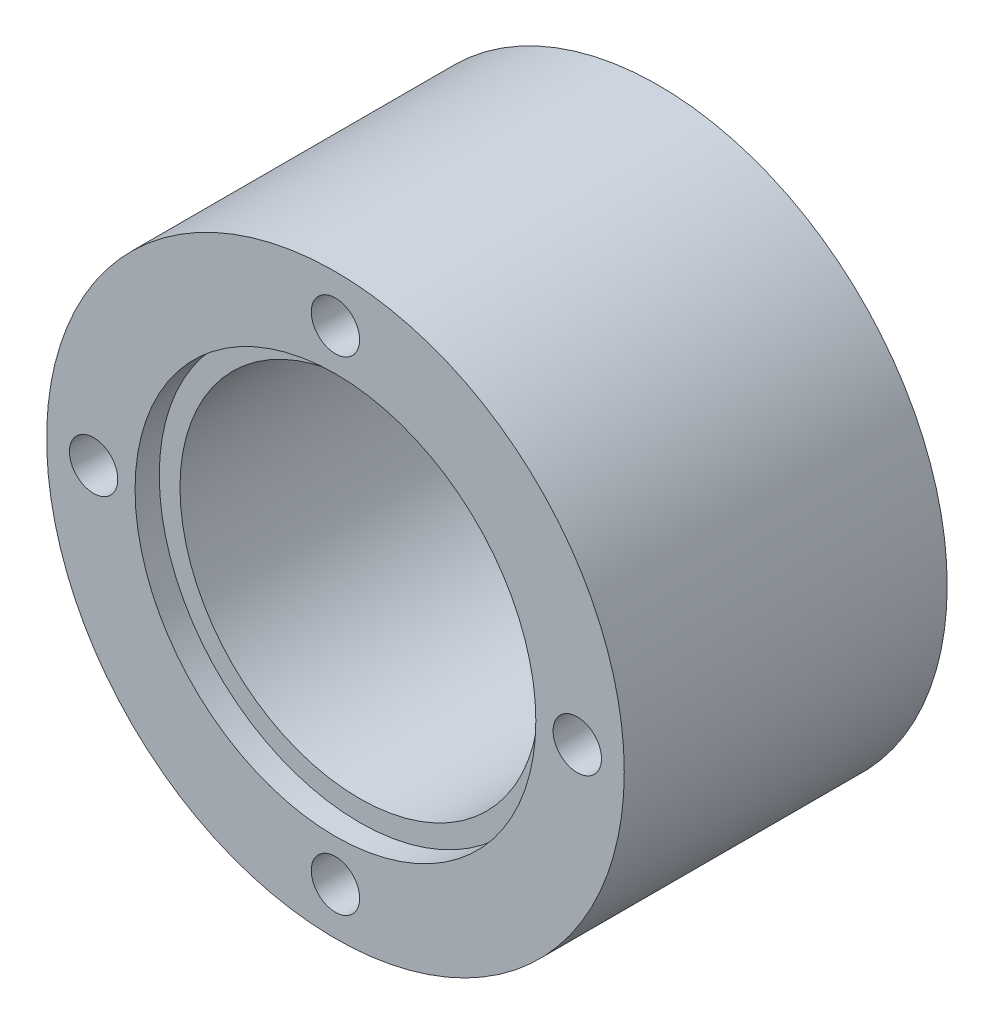
ISO-10303-21;
HEADER;
FILE_DESCRIPTION(('STEP AP214'),'2;1');
FILE_NAME('part.step','',(''),(''),'','','');
FILE_SCHEMA(('AUTOMOTIVE_DESIGN { 1 0 10303 214 1 1 1 1 }'));
ENDSEC;
DATA;
#1=APPLICATION_CONTEXT('core data for automotive mechanical design processes');
#2=APPLICATION_PROTOCOL_DEFINITION('international standard','automotive_design',2000,#1);
#3=PRODUCT_CONTEXT('',#1,'mechanical');
#4=PRODUCT('Part','Part','',(#3));
#5=PRODUCT_RELATED_PRODUCT_CATEGORY('part','',(#4));
#6=PRODUCT_DEFINITION_FORMATION('','',#4);
#7=PRODUCT_DEFINITION_CONTEXT('part definition',#1,'design');
#8=PRODUCT_DEFINITION('design','',#6,#7);
#9=PRODUCT_DEFINITION_SHAPE('','',#8);
#10=(LENGTH_UNIT() NAMED_UNIT(*) SI_UNIT(.MILLI.,.METRE.));
#11=(NAMED_UNIT(*) PLANE_ANGLE_UNIT() SI_UNIT($,.RADIAN.));
#12=(NAMED_UNIT(*) SI_UNIT($,.STERADIAN.) SOLID_ANGLE_UNIT());
#13=UNCERTAINTY_MEASURE_WITH_UNIT(LENGTH_MEASURE(1.E-05),#10,'distance_accuracy_value','');
#14=(GEOMETRIC_REPRESENTATION_CONTEXT(3) GLOBAL_UNCERTAINTY_ASSIGNED_CONTEXT((#13)) GLOBAL_UNIT_ASSIGNED_CONTEXT((#10,
#11,#12)) REPRESENTATION_CONTEXT('',''));
#15=CARTESIAN_POINT('',(0.,0.,0.));
#16=DIRECTION('',(0.,0.,1.));
#17=DIRECTION('',(1.,0.,0.));
#18=AXIS2_PLACEMENT_3D('',#15,#16,#17);
#19=CARTESIAN_POINT('',(0.,0.,0.));
#20=DIRECTION('',(0.,0.,1.));
#21=DIRECTION('',(1.,0.,0.));
#22=AXIS2_PLACEMENT_3D('',#19,#20,#21);
#23=CYLINDRICAL_SURFACE('',#22,13.);
#24=CARTESIAN_POINT('',(0.,0.,-9.93399999999999));
#25=DIRECTION('',(0.,0.,1.));
#26=DIRECTION('',(1.,0.,0.));
#27=AXIS2_PLACEMENT_3D('',#24,#25,#26);
#28=CIRCLE('',#27,13.);
#29=CARTESIAN_POINT('',(13.,0.,-9.93399999999999));
#30=VERTEX_POINT('',#29);
#31=EDGE_CURVE('E19',#30,#30,#28,.F.);
#32=ORIENTED_EDGE('',*,*,#31,.T.);
#33=EDGE_LOOP('',(#32));
#34=FACE_BOUND('',#33,.T.);
#35=CARTESIAN_POINT('',(0.,0.,9.93399999999999));
#36=DIRECTION('',(0.,0.,1.));
#37=DIRECTION('',(1.,0.,0.));
#38=AXIS2_PLACEMENT_3D('',#35,#36,#37);
#39=CIRCLE('',#38,13.);
#40=CARTESIAN_POINT('',(13.,0.,9.93399999999999));
#41=VERTEX_POINT('',#40);
#42=EDGE_CURVE('E65',#41,#41,#39,.T.);
#43=ORIENTED_EDGE('',*,*,#42,.T.);
#44=EDGE_LOOP('',(#43));
#45=FACE_BOUND('',#44,.T.);
#46=ADVANCED_FACE('F15',(#34,#45),#23,.F.);
#47=CARTESIAN_POINT('',(14.5,14.79,-9.93399999999999));
#48=DIRECTION('',(0.,0.,1.));
#49=DIRECTION('',(-1.,0.,0.));
#50=AXIS2_PLACEMENT_3D('',#47,#48,#49);
#51=PLANE('',#50);
#52=ORIENTED_EDGE('',*,*,#31,.F.);
#53=EDGE_LOOP('',(#52));
#54=FACE_BOUND('',#53,.T.);
#55=CARTESIAN_POINT('',(0.,0.,-9.93399999999999));
#56=DIRECTION('',(0.,0.,1.));
#57=DIRECTION('',(1.,0.,0.));
#58=AXIS2_PLACEMENT_3D('',#55,#56,#57);
#59=CIRCLE('',#58,14.5);
#60=CARTESIAN_POINT('',(14.5,0.,-9.93399999999999));
#61=VERTEX_POINT('',#60);
#62=EDGE_CURVE('E63',#61,#61,#59,.F.);
#63=ORIENTED_EDGE('',*,*,#62,.T.);
#64=EDGE_LOOP('',(#63));
#65=FACE_BOUND('',#64,.T.);
#66=ADVANCED_FACE('F73',(#54,#65),#51,.F.);
#67=CARTESIAN_POINT('',(0.,0.,9.93399999999999));
#68=DIRECTION('',(0.,0.,-1.));
#69=DIRECTION('',(-1.,0.,0.));
#70=AXIS2_PLACEMENT_3D('',#67,#68,#69);
#71=PLANE('',#70);
#72=ORIENTED_EDGE('',*,*,#42,.F.);
#73=EDGE_LOOP('',(#72));
#74=FACE_BOUND('',#73,.T.);
#75=CARTESIAN_POINT('',(0.,0.,9.93400000000002));
#76=DIRECTION('',(0.,0.,-1.));
#77=DIRECTION('',(-1.,0.,0.));
#78=AXIS2_PLACEMENT_3D('',#75,#76,#77);
#79=CIRCLE('',#78,14.5);
#80=CARTESIAN_POINT('',(-14.5,0.,9.93400000000002));
#81=VERTEX_POINT('',#80);
#82=EDGE_CURVE('E60',#81,#81,#79,.F.);
#83=ORIENTED_EDGE('',*,*,#82,.T.);
#84=EDGE_LOOP('',(#83));
#85=FACE_BOUND('',#84,.T.);
#86=ADVANCED_FACE('F76',(#74,#85),#71,.F.);
#87=CARTESIAN_POINT('',(0.,0.,-11.684));
#88=DIRECTION('',(0.,0.,1.));
#89=DIRECTION('',(1.,0.,0.));
#90=AXIS2_PLACEMENT_3D('',#87,#88,#89);
#91=CYLINDRICAL_SURFACE('',#90,14.5);
#92=ORIENTED_EDGE('',*,*,#62,.F.);
#93=EDGE_LOOP('',(#92));
#94=FACE_BOUND('',#93,.T.);
#95=CARTESIAN_POINT('',(0.,0.,-11.684));
#96=DIRECTION('',(0.,0.,1.));
#97=DIRECTION('',(1.,0.,0.));
#98=AXIS2_PLACEMENT_3D('',#95,#96,#97);
#99=CIRCLE('',#98,14.5);
#100=CARTESIAN_POINT('',(14.5,0.,-11.684));
#101=VERTEX_POINT('',#100);
#102=EDGE_CURVE('E57',#101,#101,#99,.T.);
#103=ORIENTED_EDGE('',*,*,#102,.F.);
#104=EDGE_LOOP('',(#103));
#105=FACE_BOUND('',#104,.T.);
#106=ADVANCED_FACE('F80',(#94,#105),#91,.F.);
#107=CARTESIAN_POINT('',(0.,0.,11.684));
#108=DIRECTION('',(0.,0.,-1.));
#109=DIRECTION('',(-1.,0.,0.));
#110=AXIS2_PLACEMENT_3D('',#107,#108,#109);
#111=CYLINDRICAL_SURFACE('',#110,14.5);
#112=CARTESIAN_POINT('',(0.,0.,11.684));
#113=DIRECTION('',(0.,0.,-1.));
#114=DIRECTION('',(-1.,0.,0.));
#115=AXIS2_PLACEMENT_3D('',#112,#113,#114);
#116=CIRCLE('',#115,14.5);
#117=CARTESIAN_POINT('',(-14.5,0.,11.684));
#118=VERTEX_POINT('',#117);
#119=EDGE_CURVE('E42',#118,#118,#116,.F.);
#120=ORIENTED_EDGE('',*,*,#119,.T.);
#121=EDGE_LOOP('',(#120));
#122=FACE_BOUND('',#121,.T.);
#123=ORIENTED_EDGE('',*,*,#82,.F.);
#124=EDGE_LOOP('',(#123));
#125=FACE_BOUND('',#124,.T.);
#126=ADVANCED_FACE('F83',(#122,#125),#111,.F.);
#127=CARTESIAN_POINT('',(0.,-17.5,11.684));
#128=DIRECTION('',(0.,0.,-1.));
#129=DIRECTION('',(-1.,0.,0.));
#130=AXIS2_PLACEMENT_3D('',#127,#128,#129);
#131=CYLINDRICAL_SURFACE('',#130,1.75000000000001);
#132=CARTESIAN_POINT('',(0.,-17.5,-11.684));
#133=DIRECTION('',(0.,0.,-1.));
#134=DIRECTION('',(-1.,0.,0.));
#135=AXIS2_PLACEMENT_3D('',#132,#133,#134);
#136=CIRCLE('',#135,1.75000000000001);
#137=CARTESIAN_POINT('',(-1.75000000000001,-17.5,-11.684));
#138=VERTEX_POINT('',#137);
#139=EDGE_CURVE('E54',#138,#138,#136,.F.);
#140=ORIENTED_EDGE('',*,*,#139,.F.);
#141=EDGE_LOOP('',(#140));
#142=FACE_BOUND('',#141,.T.);
#143=CARTESIAN_POINT('',(0.,-17.5,11.684));
#144=DIRECTION('',(0.,0.,-1.));
#145=DIRECTION('',(-1.,0.,0.));
#146=AXIS2_PLACEMENT_3D('',#143,#144,#145);
#147=CIRCLE('',#146,1.75000000000001);
#148=CARTESIAN_POINT('',(-1.75000000000001,-17.5,11.684));
#149=VERTEX_POINT('',#148);
#150=EDGE_CURVE('E39',#149,#149,#147,.F.);
#151=ORIENTED_EDGE('',*,*,#150,.T.);
#152=EDGE_LOOP('',(#151));
#153=FACE_BOUND('',#152,.T.);
#154=ADVANCED_FACE('F107',(#142,#153),#131,.F.);
#155=CARTESIAN_POINT('',(-17.5,0.,11.684));
#156=DIRECTION('',(0.,0.,-1.));
#157=DIRECTION('',(-1.,0.,0.));
#158=AXIS2_PLACEMENT_3D('',#155,#156,#157);
#159=CYLINDRICAL_SURFACE('',#158,1.75);
#160=CARTESIAN_POINT('',(-17.5,0.,-11.684));
#161=DIRECTION('',(0.,0.,-1.));
#162=DIRECTION('',(-1.,0.,0.));
#163=AXIS2_PLACEMENT_3D('',#160,#161,#162);
#164=CIRCLE('',#163,1.75);
#165=CARTESIAN_POINT('',(-19.25,0.,-11.684));
#166=VERTEX_POINT('',#165);
#167=EDGE_CURVE('E51',#166,#166,#164,.F.);
#168=ORIENTED_EDGE('',*,*,#167,.F.);
#169=EDGE_LOOP('',(#168));
#170=FACE_BOUND('',#169,.T.);
#171=CARTESIAN_POINT('',(-17.5,0.,11.684));
#172=DIRECTION('',(0.,0.,-1.));
#173=DIRECTION('',(-1.,0.,0.));
#174=AXIS2_PLACEMENT_3D('',#171,#172,#173);
#175=CIRCLE('',#174,1.75);
#176=CARTESIAN_POINT('',(-19.25,0.,11.684));
#177=VERTEX_POINT('',#176);
#178=EDGE_CURVE('E36',#177,#177,#175,.F.);
#179=ORIENTED_EDGE('',*,*,#178,.T.);
#180=EDGE_LOOP('',(#179));
#181=FACE_BOUND('',#180,.T.);
#182=ADVANCED_FACE('F116',(#170,#181),#159,.F.);
#183=CARTESIAN_POINT('',(17.5,0.,11.684));
#184=DIRECTION('',(0.,0.,-1.));
#185=DIRECTION('',(-1.,0.,0.));
#186=AXIS2_PLACEMENT_3D('',#183,#184,#185);
#187=CYLINDRICAL_SURFACE('',#186,1.75);
#188=CARTESIAN_POINT('',(17.5,0.,-11.684));
#189=DIRECTION('',(0.,0.,-1.));
#190=DIRECTION('',(-1.,0.,0.));
#191=AXIS2_PLACEMENT_3D('',#188,#189,#190);
#192=CIRCLE('',#191,1.75);
#193=CARTESIAN_POINT('',(15.75,0.,-11.684));
#194=VERTEX_POINT('',#193);
#195=EDGE_CURVE('E48',#194,#194,#192,.F.);
#196=ORIENTED_EDGE('',*,*,#195,.F.);
#197=EDGE_LOOP('',(#196));
#198=FACE_BOUND('',#197,.T.);
#199=CARTESIAN_POINT('',(17.5,0.,11.684));
#200=DIRECTION('',(0.,0.,-1.));
#201=DIRECTION('',(-1.,0.,0.));
#202=AXIS2_PLACEMENT_3D('',#199,#200,#201);
#203=CIRCLE('',#202,1.75);
#204=CARTESIAN_POINT('',(15.75,0.,11.684));
#205=VERTEX_POINT('',#204);
#206=EDGE_CURVE('E33',#205,#205,#203,.F.);
#207=ORIENTED_EDGE('',*,*,#206,.T.);
#208=EDGE_LOOP('',(#207));
#209=FACE_BOUND('',#208,.T.);
#210=ADVANCED_FACE('F119',(#198,#209),#187,.F.);
#211=CARTESIAN_POINT('',(0.,17.5,11.684));
#212=DIRECTION('',(0.,0.,-1.));
#213=DIRECTION('',(-1.,0.,0.));
#214=AXIS2_PLACEMENT_3D('',#211,#212,#213);
#215=CYLINDRICAL_SURFACE('',#214,1.75000000000001);
#216=CARTESIAN_POINT('',(0.,17.5,-11.684));
#217=DIRECTION('',(0.,0.,-1.));
#218=DIRECTION('',(-1.,0.,0.));
#219=AXIS2_PLACEMENT_3D('',#216,#217,#218);
#220=CIRCLE('',#219,1.75000000000001);
#221=CARTESIAN_POINT('',(-1.75000000000001,17.5,-11.684));
#222=VERTEX_POINT('',#221);
#223=EDGE_CURVE('E45',#222,#222,#220,.F.);
#224=ORIENTED_EDGE('',*,*,#223,.F.);
#225=EDGE_LOOP('',(#224));
#226=FACE_BOUND('',#225,.T.);
#227=CARTESIAN_POINT('',(0.,17.5,11.684));
#228=DIRECTION('',(0.,0.,-1.));
#229=DIRECTION('',(-1.,0.,0.));
#230=AXIS2_PLACEMENT_3D('',#227,#228,#229);
#231=CIRCLE('',#230,1.75000000000001);
#232=CARTESIAN_POINT('',(-1.75000000000001,17.5,11.684));
#233=VERTEX_POINT('',#232);
#234=EDGE_CURVE('E28',#233,#233,#231,.F.);
#235=ORIENTED_EDGE('',*,*,#234,.T.);
#236=EDGE_LOOP('',(#235));
#237=FACE_BOUND('',#236,.T.);
#238=ADVANCED_FACE('F17',(#226,#237),#215,.F.);
#239=CARTESIAN_POINT('',(0.,0.,-11.684));
#240=DIRECTION('',(0.,0.,-1.));
#241=DIRECTION('',(-1.,0.,0.));
#242=AXIS2_PLACEMENT_3D('',#239,#240,#241);
#243=PLANE('',#242);
#244=ORIENTED_EDGE('',*,*,#223,.T.);
#245=EDGE_LOOP('',(#244));
#246=FACE_BOUND('',#245,.T.);
#247=ORIENTED_EDGE('',*,*,#195,.T.);
#248=EDGE_LOOP('',(#247));
#249=FACE_BOUND('',#248,.T.);
#250=ORIENTED_EDGE('',*,*,#167,.T.);
#251=EDGE_LOOP('',(#250));
#252=FACE_BOUND('',#251,.T.);
#253=ORIENTED_EDGE('',*,*,#139,.T.);
#254=EDGE_LOOP('',(#253));
#255=FACE_BOUND('',#254,.T.);
#256=ORIENTED_EDGE('',*,*,#102,.T.);
#257=EDGE_LOOP('',(#256));
#258=FACE_BOUND('',#257,.T.);
#259=CARTESIAN_POINT('',(0.,0.,-11.684));
#260=DIRECTION('',(0.,0.,1.));
#261=DIRECTION('',(1.,0.,0.));
#262=AXIS2_PLACEMENT_3D('',#259,#260,#261);
#263=CIRCLE('',#262,20.9);
#264=CARTESIAN_POINT('',(20.9,0.,-11.684));
#265=VERTEX_POINT('',#264);
#266=EDGE_CURVE('E23',#265,#265,#263,.T.);
#267=ORIENTED_EDGE('',*,*,#266,.F.);
#268=EDGE_LOOP('',(#267));
#269=FACE_BOUND('',#268,.T.);
#270=ADVANCED_FACE('F87',(#246,#249,#252,#255,#258,#269),#243,.T.);
#271=CARTESIAN_POINT('',(0.,0.,11.684));
#272=DIRECTION('',(0.,0.,-1.));
#273=DIRECTION('',(-1.,0.,0.));
#274=AXIS2_PLACEMENT_3D('',#271,#272,#273);
#275=PLANE('',#274);
#276=ORIENTED_EDGE('',*,*,#234,.F.);
#277=EDGE_LOOP('',(#276));
#278=FACE_BOUND('',#277,.T.);
#279=ORIENTED_EDGE('',*,*,#206,.F.);
#280=EDGE_LOOP('',(#279));
#281=FACE_BOUND('',#280,.T.);
#282=ORIENTED_EDGE('',*,*,#178,.F.);
#283=EDGE_LOOP('',(#282));
#284=FACE_BOUND('',#283,.T.);
#285=ORIENTED_EDGE('',*,*,#150,.F.);
#286=EDGE_LOOP('',(#285));
#287=FACE_BOUND('',#286,.T.);
#288=ORIENTED_EDGE('',*,*,#119,.F.);
#289=EDGE_LOOP('',(#288));
#290=FACE_BOUND('',#289,.T.);
#291=CARTESIAN_POINT('',(0.,0.,11.684));
#292=DIRECTION('',(0.,0.,1.));
#293=DIRECTION('',(1.,0.,0.));
#294=AXIS2_PLACEMENT_3D('',#291,#292,#293);
#295=CIRCLE('',#294,20.9);
#296=CARTESIAN_POINT('',(20.9,0.,11.684));
#297=VERTEX_POINT('',#296);
#298=EDGE_CURVE('E10',#297,#297,#295,.F.);
#299=ORIENTED_EDGE('',*,*,#298,.F.);
#300=EDGE_LOOP('',(#299));
#301=FACE_BOUND('',#300,.T.);
#302=ADVANCED_FACE('F90',(#278,#281,#284,#287,#290,#301),#275,.F.);
#303=CARTESIAN_POINT('',(0.,0.,0.));
#304=DIRECTION('',(0.,0.,1.));
#305=DIRECTION('',(1.,0.,0.));
#306=AXIS2_PLACEMENT_3D('',#303,#304,#305);
#307=CYLINDRICAL_SURFACE('',#306,20.9);
#308=ORIENTED_EDGE('',*,*,#266,.T.);
#309=EDGE_LOOP('',(#308));
#310=FACE_BOUND('',#309,.T.);
#311=ORIENTED_EDGE('',*,*,#298,.T.);
#312=EDGE_LOOP('',(#311));
#313=FACE_BOUND('',#312,.T.);
#314=ADVANCED_FACE('F95',(#310,#313),#307,.T.);
#315=CLOSED_SHELL('',(#46,#66,#86,#106,#126,#154,#182,#210,#238,#270,#302,#314));
#316=MANIFOLD_SOLID_BREP('B1',#315);
#317=ADVANCED_BREP_SHAPE_REPRESENTATION('',(#18,#316),#14);
#318=SHAPE_DEFINITION_REPRESENTATION(#9,#317);
ENDSEC;
END-ISO-10303-21;
